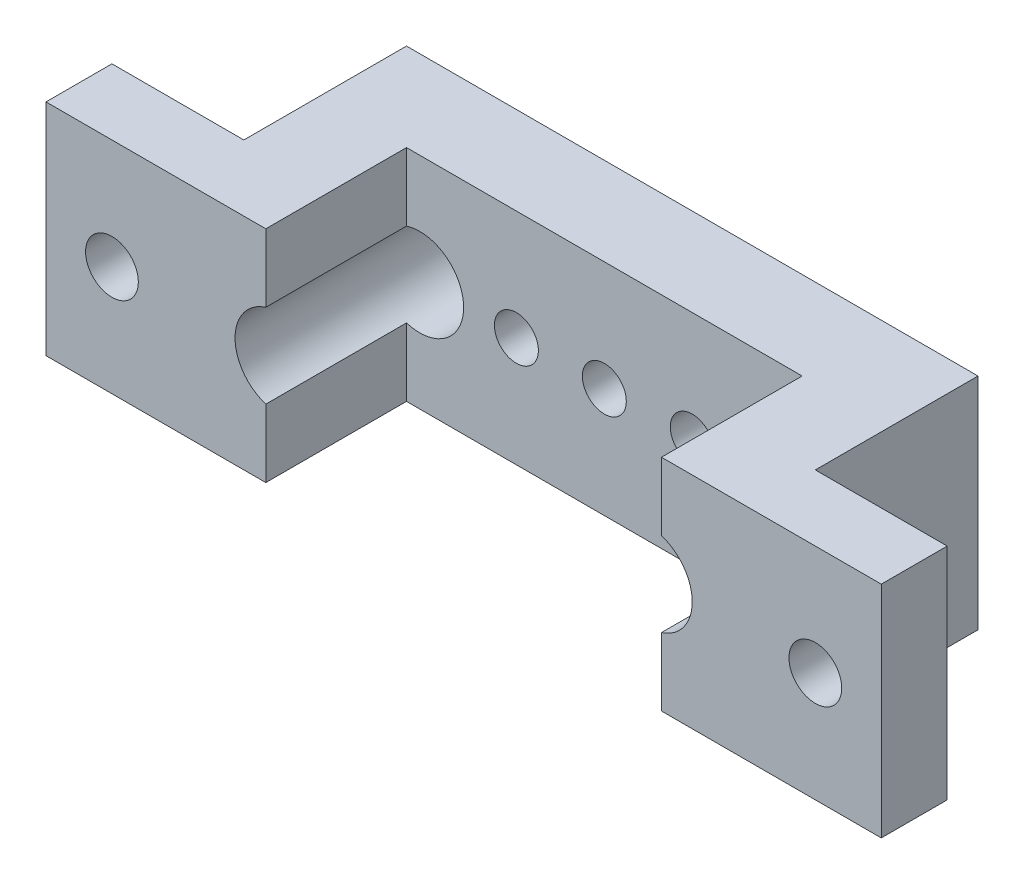
ISO-10303-21;
HEADER;
FILE_DESCRIPTION(('STEP AP214'),'2;1');
FILE_NAME('part.step','',(''),(''),'','','');
FILE_SCHEMA(('AUTOMOTIVE_DESIGN { 1 0 10303 214 1 1 1 1 }'));
ENDSEC;
DATA;
#1=APPLICATION_CONTEXT('core data for automotive mechanical design processes');
#2=APPLICATION_PROTOCOL_DEFINITION('international standard','automotive_design',2000,#1);
#3=PRODUCT_CONTEXT('',#1,'mechanical');
#4=PRODUCT('Part','Part','',(#3));
#5=PRODUCT_RELATED_PRODUCT_CATEGORY('part','',(#4));
#6=PRODUCT_DEFINITION_FORMATION('','',#4);
#7=PRODUCT_DEFINITION_CONTEXT('part definition',#1,'design');
#8=PRODUCT_DEFINITION('design','',#6,#7);
#9=PRODUCT_DEFINITION_SHAPE('','',#8);
#10=(LENGTH_UNIT() NAMED_UNIT(*) SI_UNIT(.MILLI.,.METRE.));
#11=(NAMED_UNIT(*) PLANE_ANGLE_UNIT() SI_UNIT($,.RADIAN.));
#12=(NAMED_UNIT(*) SI_UNIT($,.STERADIAN.) SOLID_ANGLE_UNIT());
#13=UNCERTAINTY_MEASURE_WITH_UNIT(LENGTH_MEASURE(1.E-05),#10,'distance_accuracy_value','');
#14=(GEOMETRIC_REPRESENTATION_CONTEXT(3) GLOBAL_UNCERTAINTY_ASSIGNED_CONTEXT((#13)) GLOBAL_UNIT_ASSIGNED_CONTEXT((#10,
#11,#12)) REPRESENTATION_CONTEXT('',''));
#15=CARTESIAN_POINT('',(0.,0.,0.));
#16=DIRECTION('',(0.,0.,1.));
#17=DIRECTION('',(1.,0.,0.));
#18=AXIS2_PLACEMENT_3D('',#15,#16,#17);
#19=CARTESIAN_POINT('',(4.2,0.,2.));
#20=DIRECTION('',(0.,0.,-1.));
#21=DIRECTION('',(-1.,0.,0.));
#22=AXIS2_PLACEMENT_3D('',#19,#20,#21);
#23=CYLINDRICAL_SURFACE('',#22,1.);
#24=CARTESIAN_POINT('',(4.2,0.,0.));
#25=DIRECTION('',(0.,0.,1.));
#26=DIRECTION('',(1.,0.,0.));
#27=AXIS2_PLACEMENT_3D('',#24,#25,#26);
#28=CIRCLE('',#27,1.);
#29=CARTESIAN_POINT('',(5.2,0.,0.));
#30=VERTEX_POINT('',#29);
#31=EDGE_CURVE('E322',#30,#30,#28,.T.);
#32=ORIENTED_EDGE('',*,*,#31,.F.);
#33=EDGE_LOOP('',(#32));
#34=FACE_BOUND('',#33,.T.);
#35=DIRECTION('',(0.,0.,-1.));
#36=VECTOR('',#35,1.);
#37=CARTESIAN_POINT('',(4.5,0.953939201416946,5.2));
#38=LINE('',#37,#36);
#39=CARTESIAN_POINT('',(4.5,0.953939201416946,5.2));
#40=VERTEX_POINT('',#39);
#41=CARTESIAN_POINT('',(4.5,0.953939201416946,2.));
#42=VERTEX_POINT('',#41);
#43=EDGE_CURVE('E253',#40,#42,#38,.T.);
#44=ORIENTED_EDGE('',*,*,#43,.T.);
#45=CARTESIAN_POINT('',(4.2,0.,2.));
#46=DIRECTION('',(0.,0.,1.));
#47=DIRECTION('',(1.,0.,0.));
#48=AXIS2_PLACEMENT_3D('',#45,#46,#47);
#49=CIRCLE('',#48,1.);
#50=CARTESIAN_POINT('',(4.5,-0.953939201416946,2.));
#51=VERTEX_POINT('',#50);
#52=EDGE_CURVE('E300',#42,#51,#49,.T.);
#53=ORIENTED_EDGE('',*,*,#52,.T.);
#54=DIRECTION('',(0.,0.,-1.));
#55=VECTOR('',#54,1.);
#56=CARTESIAN_POINT('',(4.5,-0.953939201416946,5.2));
#57=LINE('',#56,#55);
#58=CARTESIAN_POINT('',(4.5,-0.953939201416946,5.2));
#59=VERTEX_POINT('',#58);
#60=EDGE_CURVE('E261',#59,#51,#57,.T.);
#61=ORIENTED_EDGE('',*,*,#60,.F.);
#62=CARTESIAN_POINT('',(4.2,0.,5.2));
#63=DIRECTION('',(0.,0.,1.));
#64=DIRECTION('',(1.,0.,0.));
#65=AXIS2_PLACEMENT_3D('',#62,#63,#64);
#66=CIRCLE('',#65,1.);
#67=EDGE_CURVE('E242',#59,#40,#66,.T.);
#68=ORIENTED_EDGE('',*,*,#67,.T.);
#69=EDGE_LOOP('',(#44,#53,#61,#68));
#70=FACE_BOUND('',#69,.T.);
#71=ADVANCED_FACE('F69',(#34,#70),#23,.F.);
#72=CARTESIAN_POINT('',(0.,2.5,2.));
#73=DIRECTION('',(0.,1.,0.));
#74=DIRECTION('',(-1.,0.,0.));
#75=AXIS2_PLACEMENT_3D('',#72,#73,#74);
#76=PLANE('',#75);
#77=DIRECTION('',(1.,0.,0.));
#78=VECTOR('',#77,1.);
#79=CARTESIAN_POINT('',(0.,2.5,0.));
#80=LINE('',#79,#78);
#81=CARTESIAN_POINT('',(-6.5,2.5,0.));
#82=VERTEX_POINT('',#81);
#83=CARTESIAN_POINT('',(6.5,2.5,0.));
#84=VERTEX_POINT('',#83);
#85=EDGE_CURVE('E325',#82,#84,#80,.T.);
#86=ORIENTED_EDGE('',*,*,#85,.F.);
#87=DIRECTION('',(0.,0.,-1.));
#88=VECTOR('',#87,1.);
#89=CARTESIAN_POINT('',(-6.5,2.5,5.2));
#90=LINE('',#89,#88);
#91=CARTESIAN_POINT('',(-6.5,2.5,3.7));
#92=VERTEX_POINT('',#91);
#93=EDGE_CURVE('E285',#92,#82,#90,.T.);
#94=ORIENTED_EDGE('',*,*,#93,.F.);
#95=DIRECTION('',(1.,0.,0.));
#96=VECTOR('',#95,1.);
#97=CARTESIAN_POINT('',(0.,2.5,3.7));
#98=LINE('',#97,#96);
#99=CARTESIAN_POINT('',(-9.5,2.5,3.7));
#100=VERTEX_POINT('',#99);
#101=EDGE_CURVE('E94',#100,#92,#98,.T.);
#102=ORIENTED_EDGE('',*,*,#101,.F.);
#103=DIRECTION('',(0.,0.,1.));
#104=VECTOR('',#103,1.);
#105=CARTESIAN_POINT('',(-9.5,2.5,3.7));
#106=LINE('',#105,#104);
#107=CARTESIAN_POINT('',(-9.5,2.5,5.2));
#108=VERTEX_POINT('',#107);
#109=EDGE_CURVE('E234',#100,#108,#106,.T.);
#110=ORIENTED_EDGE('',*,*,#109,.T.);
#111=DIRECTION('',(-1.,0.,0.));
#112=VECTOR('',#111,1.);
#113=CARTESIAN_POINT('',(0.,2.5,5.2));
#114=LINE('',#113,#112);
#115=CARTESIAN_POINT('',(-4.5,2.5,5.2));
#116=VERTEX_POINT('',#115);
#117=EDGE_CURVE('E270',#116,#108,#114,.T.);
#118=ORIENTED_EDGE('',*,*,#117,.F.);
#119=DIRECTION('',(0.,0.,-1.));
#120=VECTOR('',#119,1.);
#121=CARTESIAN_POINT('',(-4.5,2.5,5.2));
#122=LINE('',#121,#120);
#123=CARTESIAN_POINT('',(-4.5,2.5,2.));
#124=VERTEX_POINT('',#123);
#125=EDGE_CURVE('E287',#116,#124,#122,.T.);
#126=ORIENTED_EDGE('',*,*,#125,.T.);
#127=DIRECTION('',(1.,0.,0.));
#128=VECTOR('',#127,1.);
#129=CARTESIAN_POINT('',(0.,2.5,2.));
#130=LINE('',#129,#128);
#131=CARTESIAN_POINT('',(4.5,2.5,2.));
#132=VERTEX_POINT('',#131);
#133=EDGE_CURVE('E305',#124,#132,#130,.T.);
#134=ORIENTED_EDGE('',*,*,#133,.T.);
#135=DIRECTION('',(0.,0.,-1.));
#136=VECTOR('',#135,1.);
#137=CARTESIAN_POINT('',(4.5,2.5,5.2));
#138=LINE('',#137,#136);
#139=CARTESIAN_POINT('',(4.5,2.5,5.2));
#140=VERTEX_POINT('',#139);
#141=EDGE_CURVE('E191',#140,#132,#138,.T.);
#142=ORIENTED_EDGE('',*,*,#141,.F.);
#143=DIRECTION('',(1.,0.,0.));
#144=VECTOR('',#143,1.);
#145=CARTESIAN_POINT('',(0.,2.5,5.2));
#146=LINE('',#145,#144);
#147=CARTESIAN_POINT('',(9.5,2.5,5.2));
#148=VERTEX_POINT('',#147);
#149=EDGE_CURVE('E250',#140,#148,#146,.T.);
#150=ORIENTED_EDGE('',*,*,#149,.T.);
#151=DIRECTION('',(0.,0.,1.));
#152=VECTOR('',#151,1.);
#153=CARTESIAN_POINT('',(9.5,2.5,3.7));
#154=LINE('',#153,#152);
#155=CARTESIAN_POINT('',(9.5,2.5,3.7));
#156=VERTEX_POINT('',#155);
#157=EDGE_CURVE('E205',#156,#148,#154,.T.);
#158=ORIENTED_EDGE('',*,*,#157,.F.);
#159=DIRECTION('',(-1.,0.,0.));
#160=VECTOR('',#159,1.);
#161=CARTESIAN_POINT('',(0.,2.5,3.7));
#162=LINE('',#161,#160);
#163=CARTESIAN_POINT('',(6.5,2.5,3.7));
#164=VERTEX_POINT('',#163);
#165=EDGE_CURVE('E198',#156,#164,#162,.T.);
#166=ORIENTED_EDGE('',*,*,#165,.T.);
#167=DIRECTION('',(0.,0.,-1.));
#168=VECTOR('',#167,1.);
#169=CARTESIAN_POINT('',(6.5,2.5,5.2));
#170=LINE('',#169,#168);
#171=EDGE_CURVE('E182',#164,#84,#170,.T.);
#172=ORIENTED_EDGE('',*,*,#171,.T.);
#173=EDGE_LOOP('',(#86,#94,#102,#110,#118,#126,#134,#142,#150,#158,#166,#172));
#174=FACE_BOUND('',#173,.T.);
#175=ADVANCED_FACE('F203',(#174),#76,.T.);
#176=CARTESIAN_POINT('',(-4.20000000000001,0.,2.));
#177=DIRECTION('',(0.,0.,-1.));
#178=DIRECTION('',(-1.,0.,0.));
#179=AXIS2_PLACEMENT_3D('',#176,#177,#178);
#180=CYLINDRICAL_SURFACE('',#179,0.999999999999998);
#181=CARTESIAN_POINT('',(-4.20000000000001,0.,0.));
#182=DIRECTION('',(0.,0.,1.));
#183=DIRECTION('',(1.,0.,0.));
#184=AXIS2_PLACEMENT_3D('',#181,#182,#183);
#185=CIRCLE('',#184,0.999999999999998);
#186=CARTESIAN_POINT('',(-3.20000000000001,0.,0.));
#187=VERTEX_POINT('',#186);
#188=EDGE_CURVE('E327',#187,#187,#185,.T.);
#189=ORIENTED_EDGE('',*,*,#188,.F.);
#190=EDGE_LOOP('',(#189));
#191=FACE_BOUND('',#190,.T.);
#192=CARTESIAN_POINT('',(-4.20000000000001,0.,2.));
#193=DIRECTION('',(0.,0.,1.));
#194=DIRECTION('',(1.,0.,0.));
#195=AXIS2_PLACEMENT_3D('',#192,#193,#194);
#196=CIRCLE('',#195,0.999999999999998);
#197=CARTESIAN_POINT('',(-4.5,-0.953939201416946,2.));
#198=VERTEX_POINT('',#197);
#199=CARTESIAN_POINT('',(-4.5,0.953939201416946,2.));
#200=VERTEX_POINT('',#199);
#201=EDGE_CURVE('E310',#198,#200,#196,.T.);
#202=ORIENTED_EDGE('',*,*,#201,.T.);
#203=DIRECTION('',(0.,0.,-1.));
#204=VECTOR('',#203,1.);
#205=CARTESIAN_POINT('',(-4.5,0.953939201416946,5.2));
#206=LINE('',#205,#204);
#207=CARTESIAN_POINT('',(-4.5,0.953939201416946,5.2));
#208=VERTEX_POINT('',#207);
#209=EDGE_CURVE('E290',#208,#200,#206,.T.);
#210=ORIENTED_EDGE('',*,*,#209,.F.);
#211=CARTESIAN_POINT('',(-4.20000000000001,0.,5.2));
#212=DIRECTION('',(0.,0.,1.));
#213=DIRECTION('',(1.,0.,0.));
#214=AXIS2_PLACEMENT_3D('',#211,#212,#213);
#215=CIRCLE('',#214,0.999999999999998);
#216=CARTESIAN_POINT('',(-4.5,-0.953939201416946,5.2));
#217=VERTEX_POINT('',#216);
#218=EDGE_CURVE('E264',#208,#217,#215,.T.);
#219=ORIENTED_EDGE('',*,*,#218,.T.);
#220=DIRECTION('',(0.,0.,-1.));
#221=VECTOR('',#220,1.);
#222=CARTESIAN_POINT('',(-4.5,-0.953939201416946,5.2));
#223=LINE('',#222,#221);
#224=EDGE_CURVE('E277',#217,#198,#223,.T.);
#225=ORIENTED_EDGE('',*,*,#224,.T.);
#226=EDGE_LOOP('',(#202,#210,#219,#225));
#227=FACE_BOUND('',#226,.T.);
#228=ADVANCED_FACE('F359',(#191,#227),#180,.F.);
#229=CARTESIAN_POINT('',(0.,-2.5,2.));
#230=DIRECTION('',(0.,1.,0.));
#231=DIRECTION('',(-1.,0.,0.));
#232=AXIS2_PLACEMENT_3D('',#229,#230,#231);
#233=PLANE('',#232);
#234=DIRECTION('',(1.,0.,0.));
#235=VECTOR('',#234,1.);
#236=CARTESIAN_POINT('',(0.,-2.5,0.));
#237=LINE('',#236,#235);
#238=CARTESIAN_POINT('',(-6.5,-2.5,0.));
#239=VERTEX_POINT('',#238);
#240=CARTESIAN_POINT('',(6.5,-2.5,0.));
#241=VERTEX_POINT('',#240);
#242=EDGE_CURVE('E329',#239,#241,#237,.T.);
#243=ORIENTED_EDGE('',*,*,#242,.T.);
#244=DIRECTION('',(0.,0.,-1.));
#245=VECTOR('',#244,1.);
#246=CARTESIAN_POINT('',(6.5,-2.5,5.2));
#247=LINE('',#246,#245);
#248=CARTESIAN_POINT('',(6.5,-2.5,3.7));
#249=VERTEX_POINT('',#248);
#250=EDGE_CURVE('E190',#249,#241,#247,.T.);
#251=ORIENTED_EDGE('',*,*,#250,.F.);
#252=DIRECTION('',(-1.,0.,0.));
#253=VECTOR('',#252,1.);
#254=CARTESIAN_POINT('',(0.,-2.5,3.7));
#255=LINE('',#254,#253);
#256=CARTESIAN_POINT('',(9.5,-2.5,3.7));
#257=VERTEX_POINT('',#256);
#258=EDGE_CURVE('E201',#257,#249,#255,.T.);
#259=ORIENTED_EDGE('',*,*,#258,.F.);
#260=DIRECTION('',(0.,0.,1.));
#261=VECTOR('',#260,1.);
#262=CARTESIAN_POINT('',(9.5,-2.5,3.7));
#263=LINE('',#262,#261);
#264=CARTESIAN_POINT('',(9.5,-2.5,5.2));
#265=VERTEX_POINT('',#264);
#266=EDGE_CURVE('E208',#257,#265,#263,.T.);
#267=ORIENTED_EDGE('',*,*,#266,.T.);
#268=DIRECTION('',(1.,0.,0.));
#269=VECTOR('',#268,1.);
#270=CARTESIAN_POINT('',(0.,-2.5,5.2));
#271=LINE('',#270,#269);
#272=CARTESIAN_POINT('',(4.5,-2.5,5.2));
#273=VERTEX_POINT('',#272);
#274=EDGE_CURVE('E247',#273,#265,#271,.T.);
#275=ORIENTED_EDGE('',*,*,#274,.F.);
#276=DIRECTION('',(0.,0.,-1.));
#277=VECTOR('',#276,1.);
#278=CARTESIAN_POINT('',(4.5,-2.5,5.2));
#279=LINE('',#278,#277);
#280=CARTESIAN_POINT('',(4.5,-2.5,2.));
#281=VERTEX_POINT('',#280);
#282=EDGE_CURVE('E258',#273,#281,#279,.T.);
#283=ORIENTED_EDGE('',*,*,#282,.T.);
#284=DIRECTION('',(1.,0.,0.));
#285=VECTOR('',#284,1.);
#286=CARTESIAN_POINT('',(0.,-2.5,2.));
#287=LINE('',#286,#285);
#288=CARTESIAN_POINT('',(-4.5,-2.5,2.));
#289=VERTEX_POINT('',#288);
#290=EDGE_CURVE('E314',#289,#281,#287,.T.);
#291=ORIENTED_EDGE('',*,*,#290,.F.);
#292=DIRECTION('',(0.,0.,-1.));
#293=VECTOR('',#292,1.);
#294=CARTESIAN_POINT('',(-4.5,-2.5,5.2));
#295=LINE('',#294,#293);
#296=CARTESIAN_POINT('',(-4.5,-2.5,5.2));
#297=VERTEX_POINT('',#296);
#298=EDGE_CURVE('E280',#297,#289,#295,.T.);
#299=ORIENTED_EDGE('',*,*,#298,.F.);
#300=DIRECTION('',(-1.,0.,0.));
#301=VECTOR('',#300,1.);
#302=CARTESIAN_POINT('',(0.,-2.5,5.2));
#303=LINE('',#302,#301);
#304=CARTESIAN_POINT('',(-9.5,-2.5,5.2));
#305=VERTEX_POINT('',#304);
#306=EDGE_CURVE('E273',#297,#305,#303,.T.);
#307=ORIENTED_EDGE('',*,*,#306,.T.);
#308=DIRECTION('',(0.,0.,1.));
#309=VECTOR('',#308,1.);
#310=CARTESIAN_POINT('',(-9.5,-2.5,3.7));
#311=LINE('',#310,#309);
#312=CARTESIAN_POINT('',(-9.5,-2.5,3.7));
#313=VERTEX_POINT('',#312);
#314=EDGE_CURVE('E237',#313,#305,#311,.T.);
#315=ORIENTED_EDGE('',*,*,#314,.F.);
#316=DIRECTION('',(1.,0.,0.));
#317=VECTOR('',#316,1.);
#318=CARTESIAN_POINT('',(0.,-2.5,3.7));
#319=LINE('',#318,#317);
#320=CARTESIAN_POINT('',(-6.5,-2.5,3.7));
#321=VERTEX_POINT('',#320);
#322=EDGE_CURVE('E226',#313,#321,#319,.T.);
#323=ORIENTED_EDGE('',*,*,#322,.T.);
#324=DIRECTION('',(0.,0.,-1.));
#325=VECTOR('',#324,1.);
#326=CARTESIAN_POINT('',(-6.5,-2.5,5.2));
#327=LINE('',#326,#325);
#328=EDGE_CURVE('E283',#321,#239,#327,.T.);
#329=ORIENTED_EDGE('',*,*,#328,.T.);
#330=EDGE_LOOP('',(#243,#251,#259,#267,#275,#283,#291,#299,#307,#315,#323,#329));
#331=FACE_BOUND('',#330,.T.);
#332=ADVANCED_FACE('F365',(#331),#233,.F.);
#333=CARTESIAN_POINT('',(0.,0.,2.));
#334=DIRECTION('',(0.,0.,-1.));
#335=DIRECTION('',(-1.,0.,0.));
#336=AXIS2_PLACEMENT_3D('',#333,#334,#335);
#337=CYLINDRICAL_SURFACE('',#336,0.5);
#338=CARTESIAN_POINT('',(0.,0.,2.));
#339=DIRECTION('',(0.,0.,1.));
#340=DIRECTION('',(1.,0.,0.));
#341=AXIS2_PLACEMENT_3D('',#338,#339,#340);
#342=CIRCLE('',#341,0.5);
#343=CARTESIAN_POINT('',(0.5,0.,2.));
#344=VERTEX_POINT('',#343);
#345=EDGE_CURVE('E297',#344,#344,#342,.T.);
#346=ORIENTED_EDGE('',*,*,#345,.T.);
#347=EDGE_LOOP('',(#346));
#348=FACE_BOUND('',#347,.T.);
#349=CARTESIAN_POINT('',(0.,0.,0.));
#350=DIRECTION('',(0.,0.,1.));
#351=DIRECTION('',(1.,0.,0.));
#352=AXIS2_PLACEMENT_3D('',#349,#350,#351);
#353=CIRCLE('',#352,0.5);
#354=CARTESIAN_POINT('',(0.5,0.,0.));
#355=VERTEX_POINT('',#354);
#356=EDGE_CURVE('E319',#355,#355,#353,.T.);
#357=ORIENTED_EDGE('',*,*,#356,.F.);
#358=EDGE_LOOP('',(#357));
#359=FACE_BOUND('',#358,.T.);
#360=ADVANCED_FACE('F349',(#348,#359),#337,.F.);
#361=CARTESIAN_POINT('',(2.,0.,2.));
#362=DIRECTION('',(0.,0.,-1.));
#363=DIRECTION('',(-1.,0.,0.));
#364=AXIS2_PLACEMENT_3D('',#361,#362,#363);
#365=CYLINDRICAL_SURFACE('',#364,0.5);
#366=CARTESIAN_POINT('',(2.,0.,2.));
#367=DIRECTION('',(0.,0.,1.));
#368=DIRECTION('',(1.,0.,0.));
#369=AXIS2_PLACEMENT_3D('',#366,#367,#368);
#370=CIRCLE('',#369,0.5);
#371=CARTESIAN_POINT('',(2.5,0.,2.));
#372=VERTEX_POINT('',#371);
#373=EDGE_CURVE('E294',#372,#372,#370,.T.);
#374=ORIENTED_EDGE('',*,*,#373,.T.);
#375=EDGE_LOOP('',(#374));
#376=FACE_BOUND('',#375,.T.);
#377=CARTESIAN_POINT('',(2.,0.,0.));
#378=DIRECTION('',(0.,0.,1.));
#379=DIRECTION('',(1.,0.,0.));
#380=AXIS2_PLACEMENT_3D('',#377,#378,#379);
#381=CIRCLE('',#380,0.5);
#382=CARTESIAN_POINT('',(2.5,0.,0.));
#383=VERTEX_POINT('',#382);
#384=EDGE_CURVE('E293',#383,#383,#381,.T.);
#385=ORIENTED_EDGE('',*,*,#384,.F.);
#386=EDGE_LOOP('',(#385));
#387=FACE_BOUND('',#386,.T.);
#388=ADVANCED_FACE('F71',(#376,#387),#365,.F.);
#389=CARTESIAN_POINT('',(-2.,0.,2.));
#390=DIRECTION('',(0.,0.,-1.));
#391=DIRECTION('',(-1.,0.,0.));
#392=AXIS2_PLACEMENT_3D('',#389,#390,#391);
#393=CYLINDRICAL_SURFACE('',#392,0.5);
#394=CARTESIAN_POINT('',(-2.,0.,2.));
#395=DIRECTION('',(0.,0.,1.));
#396=DIRECTION('',(1.,0.,0.));
#397=AXIS2_PLACEMENT_3D('',#394,#395,#396);
#398=CIRCLE('',#397,0.5);
#399=CARTESIAN_POINT('',(-1.5,0.,2.));
#400=VERTEX_POINT('',#399);
#401=EDGE_CURVE('E12',#400,#400,#398,.T.);
#402=ORIENTED_EDGE('',*,*,#401,.T.);
#403=EDGE_LOOP('',(#402));
#404=FACE_BOUND('',#403,.T.);
#405=CARTESIAN_POINT('',(-2.,0.,0.));
#406=DIRECTION('',(0.,0.,1.));
#407=DIRECTION('',(1.,0.,0.));
#408=AXIS2_PLACEMENT_3D('',#405,#406,#407);
#409=CIRCLE('',#408,0.5);
#410=CARTESIAN_POINT('',(-1.5,0.,0.));
#411=VERTEX_POINT('',#410);
#412=EDGE_CURVE('E73',#411,#411,#409,.T.);
#413=ORIENTED_EDGE('',*,*,#412,.F.);
#414=EDGE_LOOP('',(#413));
#415=FACE_BOUND('',#414,.T.);
#416=ADVANCED_FACE('F338',(#404,#415),#393,.F.);
#417=CARTESIAN_POINT('',(0.,0.,2.));
#418=DIRECTION('',(0.,0.,1.));
#419=DIRECTION('',(1.,0.,0.));
#420=AXIS2_PLACEMENT_3D('',#417,#418,#419);
#421=PLANE('',#420);
#422=ORIENTED_EDGE('',*,*,#373,.F.);
#423=EDGE_LOOP('',(#422));
#424=FACE_BOUND('',#423,.T.);
#425=ORIENTED_EDGE('',*,*,#345,.F.);
#426=EDGE_LOOP('',(#425));
#427=FACE_BOUND('',#426,.T.);
#428=ORIENTED_EDGE('',*,*,#52,.F.);
#429=DIRECTION('',(0.,-1.,0.));
#430=VECTOR('',#429,1.);
#431=CARTESIAN_POINT('',(4.5,0.,2.));
#432=LINE('',#431,#430);
#433=EDGE_CURVE('E303',#132,#42,#432,.T.);
#434=ORIENTED_EDGE('',*,*,#433,.F.);
#435=ORIENTED_EDGE('',*,*,#133,.F.);
#436=DIRECTION('',(0.,-1.,0.));
#437=VECTOR('',#436,1.);
#438=CARTESIAN_POINT('',(-4.5,0.,2.));
#439=LINE('',#438,#437);
#440=EDGE_CURVE('E308',#124,#200,#439,.T.);
#441=ORIENTED_EDGE('',*,*,#440,.T.);
#442=ORIENTED_EDGE('',*,*,#201,.F.);
#443=EDGE_CURVE('E311',#198,#289,#439,.T.);
#444=ORIENTED_EDGE('',*,*,#443,.T.);
#445=ORIENTED_EDGE('',*,*,#290,.T.);
#446=EDGE_CURVE('E78',#51,#281,#432,.T.);
#447=ORIENTED_EDGE('',*,*,#446,.F.);
#448=EDGE_LOOP('',(#428,#434,#435,#441,#442,#444,#445,#447));
#449=FACE_BOUND('',#448,.T.);
#450=ORIENTED_EDGE('',*,*,#401,.F.);
#451=EDGE_LOOP('',(#450));
#452=FACE_BOUND('',#451,.T.);
#453=ADVANCED_FACE('F340',(#424,#427,#449,#452),#421,.T.);
#454=CARTESIAN_POINT('',(0.,0.,0.));
#455=DIRECTION('',(0.,0.,1.));
#456=DIRECTION('',(1.,0.,0.));
#457=AXIS2_PLACEMENT_3D('',#454,#455,#456);
#458=PLANE('',#457);
#459=DIRECTION('',(0.,-1.,0.));
#460=VECTOR('',#459,1.);
#461=CARTESIAN_POINT('',(6.5,0.,0.));
#462=LINE('',#461,#460);
#463=EDGE_CURVE('E185',#84,#241,#462,.T.);
#464=ORIENTED_EDGE('',*,*,#463,.T.);
#465=ORIENTED_EDGE('',*,*,#242,.F.);
#466=DIRECTION('',(0.,-1.,0.));
#467=VECTOR('',#466,1.);
#468=CARTESIAN_POINT('',(-6.5,0.,0.));
#469=LINE('',#468,#467);
#470=EDGE_CURVE('E263',#82,#239,#469,.T.);
#471=ORIENTED_EDGE('',*,*,#470,.F.);
#472=ORIENTED_EDGE('',*,*,#85,.T.);
#473=EDGE_LOOP('',(#464,#465,#471,#472));
#474=FACE_BOUND('',#473,.T.);
#475=ORIENTED_EDGE('',*,*,#188,.T.);
#476=EDGE_LOOP('',(#475));
#477=FACE_BOUND('',#476,.T.);
#478=ORIENTED_EDGE('',*,*,#384,.T.);
#479=EDGE_LOOP('',(#478));
#480=FACE_BOUND('',#479,.T.);
#481=ORIENTED_EDGE('',*,*,#356,.T.);
#482=EDGE_LOOP('',(#481));
#483=FACE_BOUND('',#482,.T.);
#484=ORIENTED_EDGE('',*,*,#31,.T.);
#485=EDGE_LOOP('',(#484));
#486=FACE_BOUND('',#485,.T.);
#487=ORIENTED_EDGE('',*,*,#412,.T.);
#488=EDGE_LOOP('',(#487));
#489=FACE_BOUND('',#488,.T.);
#490=ADVANCED_FACE('F336',(#474,#477,#480,#483,#486,#489),#458,.F.);
#491=CARTESIAN_POINT('',(-4.5,0.,5.2));
#492=DIRECTION('',(1.,0.,0.));
#493=DIRECTION('',(0.,0.,-1.));
#494=AXIS2_PLACEMENT_3D('',#491,#492,#493);
#495=PLANE('',#494);
#496=ORIENTED_EDGE('',*,*,#209,.T.);
#497=ORIENTED_EDGE('',*,*,#440,.F.);
#498=ORIENTED_EDGE('',*,*,#125,.F.);
#499=DIRECTION('',(0.,-1.,0.));
#500=VECTOR('',#499,1.);
#501=CARTESIAN_POINT('',(-4.5,0.,5.2));
#502=LINE('',#501,#500);
#503=EDGE_CURVE('E267',#116,#208,#502,.T.);
#504=ORIENTED_EDGE('',*,*,#503,.T.);
#505=EDGE_LOOP('',(#496,#497,#498,#504));
#506=FACE_BOUND('',#505,.T.);
#507=ADVANCED_FACE('F376',(#506),#495,.T.);
#508=CARTESIAN_POINT('',(-6.5,0.,5.2));
#509=DIRECTION('',(1.,0.,0.));
#510=DIRECTION('',(0.,0.,-1.));
#511=AXIS2_PLACEMENT_3D('',#508,#509,#510);
#512=PLANE('',#511);
#513=ORIENTED_EDGE('',*,*,#328,.F.);
#514=DIRECTION('',(0.,1.,0.));
#515=VECTOR('',#514,1.);
#516=CARTESIAN_POINT('',(-6.5,0.,3.7));
#517=LINE('',#516,#515);
#518=EDGE_CURVE('E229',#321,#92,#517,.T.);
#519=ORIENTED_EDGE('',*,*,#518,.T.);
#520=ORIENTED_EDGE('',*,*,#93,.T.);
#521=ORIENTED_EDGE('',*,*,#470,.T.);
#522=EDGE_LOOP('',(#513,#519,#520,#521));
#523=FACE_BOUND('',#522,.T.);
#524=ADVANCED_FACE('F381',(#523),#512,.F.);
#525=ORIENTED_EDGE('',*,*,#298,.T.);
#526=ORIENTED_EDGE('',*,*,#443,.F.);
#527=ORIENTED_EDGE('',*,*,#224,.F.);
#528=EDGE_CURVE('E271',#217,#297,#502,.T.);
#529=ORIENTED_EDGE('',*,*,#528,.T.);
#530=EDGE_LOOP('',(#525,#526,#527,#529));
#531=FACE_BOUND('',#530,.T.);
#532=ADVANCED_FACE('F384',(#531),#495,.T.);
#533=CARTESIAN_POINT('',(0.,0.,5.2));
#534=DIRECTION('',(0.,0.,1.));
#535=DIRECTION('',(1.,0.,0.));
#536=AXIS2_PLACEMENT_3D('',#533,#534,#535);
#537=PLANE('',#536);
#538=ORIENTED_EDGE('',*,*,#218,.F.);
#539=ORIENTED_EDGE('',*,*,#503,.F.);
#540=ORIENTED_EDGE('',*,*,#117,.T.);
#541=DIRECTION('',(0.,1.,0.));
#542=VECTOR('',#541,1.);
#543=CARTESIAN_POINT('',(-9.5,0.,5.2));
#544=LINE('',#543,#542);
#545=EDGE_CURVE('E223',#305,#108,#544,.T.);
#546=ORIENTED_EDGE('',*,*,#545,.F.);
#547=ORIENTED_EDGE('',*,*,#306,.F.);
#548=ORIENTED_EDGE('',*,*,#528,.F.);
#549=EDGE_LOOP('',(#538,#539,#540,#546,#547,#548));
#550=FACE_BOUND('',#549,.T.);
#551=CARTESIAN_POINT('',(-8.,0.,5.2));
#552=DIRECTION('',(0.,0.,1.));
#553=DIRECTION('',(1.,0.,0.));
#554=AXIS2_PLACEMENT_3D('',#551,#552,#553);
#555=CIRCLE('',#554,0.6);
#556=CARTESIAN_POINT('',(-7.4,0.,5.2));
#557=VERTEX_POINT('',#556);
#558=EDGE_CURVE('E219',#557,#557,#555,.T.);
#559=ORIENTED_EDGE('',*,*,#558,.F.);
#560=EDGE_LOOP('',(#559));
#561=FACE_BOUND('',#560,.T.);
#562=ADVANCED_FACE('F391',(#550,#561),#537,.T.);
#563=CARTESIAN_POINT('',(4.5,0.,5.2));
#564=DIRECTION('',(1.,0.,0.));
#565=DIRECTION('',(0.,0.,-1.));
#566=AXIS2_PLACEMENT_3D('',#563,#564,#565);
#567=PLANE('',#566);
#568=ORIENTED_EDGE('',*,*,#446,.T.);
#569=ORIENTED_EDGE('',*,*,#282,.F.);
#570=DIRECTION('',(0.,-1.,0.));
#571=VECTOR('',#570,1.);
#572=CARTESIAN_POINT('',(4.5,0.,5.2));
#573=LINE('',#572,#571);
#574=EDGE_CURVE('E245',#59,#273,#573,.T.);
#575=ORIENTED_EDGE('',*,*,#574,.F.);
#576=ORIENTED_EDGE('',*,*,#60,.T.);
#577=EDGE_LOOP('',(#568,#569,#575,#576));
#578=FACE_BOUND('',#577,.T.);
#579=ADVANCED_FACE('F395',(#578),#567,.F.);
#580=CARTESIAN_POINT('',(6.5,0.,5.2));
#581=DIRECTION('',(1.,0.,0.));
#582=DIRECTION('',(0.,0.,-1.));
#583=AXIS2_PLACEMENT_3D('',#580,#581,#582);
#584=PLANE('',#583);
#585=DIRECTION('',(0.,1.,0.));
#586=VECTOR('',#585,1.);
#587=CARTESIAN_POINT('',(6.5,0.,3.7));
#588=LINE('',#587,#586);
#589=EDGE_CURVE('E86',#249,#164,#588,.T.);
#590=ORIENTED_EDGE('',*,*,#589,.F.);
#591=ORIENTED_EDGE('',*,*,#250,.T.);
#592=ORIENTED_EDGE('',*,*,#463,.F.);
#593=ORIENTED_EDGE('',*,*,#171,.F.);
#594=EDGE_LOOP('',(#590,#591,#592,#593));
#595=FACE_BOUND('',#594,.T.);
#596=ADVANCED_FACE('F183',(#595),#584,.T.);
#597=ORIENTED_EDGE('',*,*,#433,.T.);
#598=ORIENTED_EDGE('',*,*,#43,.F.);
#599=EDGE_CURVE('E248',#140,#40,#573,.T.);
#600=ORIENTED_EDGE('',*,*,#599,.F.);
#601=ORIENTED_EDGE('',*,*,#141,.T.);
#602=EDGE_LOOP('',(#597,#598,#600,#601));
#603=FACE_BOUND('',#602,.T.);
#604=ADVANCED_FACE('F399',(#603),#567,.F.);
#605=CARTESIAN_POINT('',(0.,0.,5.2));
#606=DIRECTION('',(0.,0.,1.));
#607=DIRECTION('',(1.,0.,0.));
#608=AXIS2_PLACEMENT_3D('',#605,#606,#607);
#609=PLANE('',#608);
#610=ORIENTED_EDGE('',*,*,#67,.F.);
#611=ORIENTED_EDGE('',*,*,#574,.T.);
#612=ORIENTED_EDGE('',*,*,#274,.T.);
#613=DIRECTION('',(0.,1.,0.));
#614=VECTOR('',#613,1.);
#615=CARTESIAN_POINT('',(9.5,0.,5.2));
#616=LINE('',#615,#614);
#617=EDGE_CURVE('E212',#265,#148,#616,.T.);
#618=ORIENTED_EDGE('',*,*,#617,.T.);
#619=ORIENTED_EDGE('',*,*,#149,.F.);
#620=ORIENTED_EDGE('',*,*,#599,.T.);
#621=EDGE_LOOP('',(#610,#611,#612,#618,#619,#620));
#622=FACE_BOUND('',#621,.T.);
#623=CARTESIAN_POINT('',(8.,0.,5.2));
#624=DIRECTION('',(0.,0.,1.));
#625=DIRECTION('',(1.,0.,0.));
#626=AXIS2_PLACEMENT_3D('',#623,#624,#625);
#627=CIRCLE('',#626,0.6);
#628=CARTESIAN_POINT('',(8.6,0.,5.2));
#629=VERTEX_POINT('',#628);
#630=EDGE_CURVE('E436',#629,#629,#627,.T.);
#631=ORIENTED_EDGE('',*,*,#630,.F.);
#632=EDGE_LOOP('',(#631));
#633=FACE_BOUND('',#632,.T.);
#634=ADVANCED_FACE('F402',(#622,#633),#609,.T.);
#635=CARTESIAN_POINT('',(-9.5,0.,3.7));
#636=DIRECTION('',(1.,0.,0.));
#637=DIRECTION('',(0.,0.,-1.));
#638=AXIS2_PLACEMENT_3D('',#635,#636,#637);
#639=PLANE('',#638);
#640=ORIENTED_EDGE('',*,*,#545,.T.);
#641=ORIENTED_EDGE('',*,*,#109,.F.);
#642=DIRECTION('',(0.,1.,0.));
#643=VECTOR('',#642,1.);
#644=CARTESIAN_POINT('',(-9.5,0.,3.7));
#645=LINE('',#644,#643);
#646=EDGE_CURVE('E232',#313,#100,#645,.T.);
#647=ORIENTED_EDGE('',*,*,#646,.F.);
#648=ORIENTED_EDGE('',*,*,#314,.T.);
#649=EDGE_LOOP('',(#640,#641,#647,#648));
#650=FACE_BOUND('',#649,.T.);
#651=ADVANCED_FACE('F406',(#650),#639,.F.);
#652=CARTESIAN_POINT('',(0.,0.,3.7));
#653=DIRECTION('',(0.,0.,1.));
#654=DIRECTION('',(1.,0.,0.));
#655=AXIS2_PLACEMENT_3D('',#652,#653,#654);
#656=PLANE('',#655);
#657=CARTESIAN_POINT('',(-8.,0.,3.7));
#658=DIRECTION('',(0.,0.,1.));
#659=DIRECTION('',(1.,0.,0.));
#660=AXIS2_PLACEMENT_3D('',#657,#658,#659);
#661=CIRCLE('',#660,0.6);
#662=CARTESIAN_POINT('',(-7.4,0.,3.7));
#663=VERTEX_POINT('',#662);
#664=EDGE_CURVE('E220',#663,#663,#661,.T.);
#665=ORIENTED_EDGE('',*,*,#664,.T.);
#666=EDGE_LOOP('',(#665));
#667=FACE_BOUND('',#666,.T.);
#668=ORIENTED_EDGE('',*,*,#322,.F.);
#669=ORIENTED_EDGE('',*,*,#646,.T.);
#670=ORIENTED_EDGE('',*,*,#101,.T.);
#671=ORIENTED_EDGE('',*,*,#518,.F.);
#672=EDGE_LOOP('',(#668,#669,#670,#671));
#673=FACE_BOUND('',#672,.T.);
#674=ADVANCED_FACE('F410',(#667,#673),#656,.F.);
#675=CARTESIAN_POINT('',(-8.,0.,3.7));
#676=DIRECTION('',(0.,0.,1.));
#677=DIRECTION('',(1.,0.,0.));
#678=AXIS2_PLACEMENT_3D('',#675,#676,#677);
#679=CYLINDRICAL_SURFACE('',#678,0.6);
#680=ORIENTED_EDGE('',*,*,#664,.F.);
#681=EDGE_LOOP('',(#680));
#682=FACE_BOUND('',#681,.T.);
#683=ORIENTED_EDGE('',*,*,#558,.T.);
#684=EDGE_LOOP('',(#683));
#685=FACE_BOUND('',#684,.T.);
#686=ADVANCED_FACE('F414',(#682,#685),#679,.F.);
#687=CARTESIAN_POINT('',(9.5,0.,3.7));
#688=DIRECTION('',(1.,0.,0.));
#689=DIRECTION('',(0.,0.,-1.));
#690=AXIS2_PLACEMENT_3D('',#687,#688,#689);
#691=PLANE('',#690);
#692=ORIENTED_EDGE('',*,*,#617,.F.);
#693=ORIENTED_EDGE('',*,*,#266,.F.);
#694=DIRECTION('',(0.,1.,0.));
#695=VECTOR('',#694,1.);
#696=CARTESIAN_POINT('',(9.5,0.,3.7));
#697=LINE('',#696,#695);
#698=EDGE_CURVE('E206',#257,#156,#697,.T.);
#699=ORIENTED_EDGE('',*,*,#698,.T.);
#700=ORIENTED_EDGE('',*,*,#157,.T.);
#701=EDGE_LOOP('',(#692,#693,#699,#700));
#702=FACE_BOUND('',#701,.T.);
#703=ADVANCED_FACE('F418',(#702),#691,.T.);
#704=CARTESIAN_POINT('',(0.,0.,3.7));
#705=DIRECTION('',(0.,0.,-1.));
#706=DIRECTION('',(-1.,0.,0.));
#707=AXIS2_PLACEMENT_3D('',#704,#705,#706);
#708=PLANE('',#707);
#709=CARTESIAN_POINT('',(8.,0.,3.7));
#710=DIRECTION('',(0.,0.,1.));
#711=DIRECTION('',(1.,0.,0.));
#712=AXIS2_PLACEMENT_3D('',#709,#710,#711);
#713=CIRCLE('',#712,0.6);
#714=CARTESIAN_POINT('',(8.6,0.,3.7));
#715=VERTEX_POINT('',#714);
#716=EDGE_CURVE('E215',#715,#715,#713,.T.);
#717=ORIENTED_EDGE('',*,*,#716,.T.);
#718=EDGE_LOOP('',(#717));
#719=FACE_BOUND('',#718,.T.);
#720=ORIENTED_EDGE('',*,*,#258,.T.);
#721=ORIENTED_EDGE('',*,*,#589,.T.);
#722=ORIENTED_EDGE('',*,*,#165,.F.);
#723=ORIENTED_EDGE('',*,*,#698,.F.);
#724=EDGE_LOOP('',(#720,#721,#722,#723));
#725=FACE_BOUND('',#724,.T.);
#726=ADVANCED_FACE('F196',(#719,#725),#708,.T.);
#727=CARTESIAN_POINT('',(8.,0.,3.7));
#728=DIRECTION('',(0.,0.,1.));
#729=DIRECTION('',(1.,0.,0.));
#730=AXIS2_PLACEMENT_3D('',#727,#728,#729);
#731=CYLINDRICAL_SURFACE('',#730,0.6);
#732=ORIENTED_EDGE('',*,*,#716,.F.);
#733=EDGE_LOOP('',(#732));
#734=FACE_BOUND('',#733,.T.);
#735=ORIENTED_EDGE('',*,*,#630,.T.);
#736=EDGE_LOOP('',(#735));
#737=FACE_BOUND('',#736,.T.);
#738=ADVANCED_FACE('F425',(#734,#737),#731,.F.);
#739=CLOSED_SHELL('',(#71,#175,#228,#332,#360,#388,#416,#453,#490,#507,#524,#532,#562,#579,#596,
#604,#634,#651,#674,#686,#703,#726,#738));
#740=MANIFOLD_SOLID_BREP('B2',#739);
#741=ADVANCED_BREP_SHAPE_REPRESENTATION('',(#18,#740),#14);
#742=SHAPE_DEFINITION_REPRESENTATION(#9,#741);
ENDSEC;
END-ISO-10303-21;
